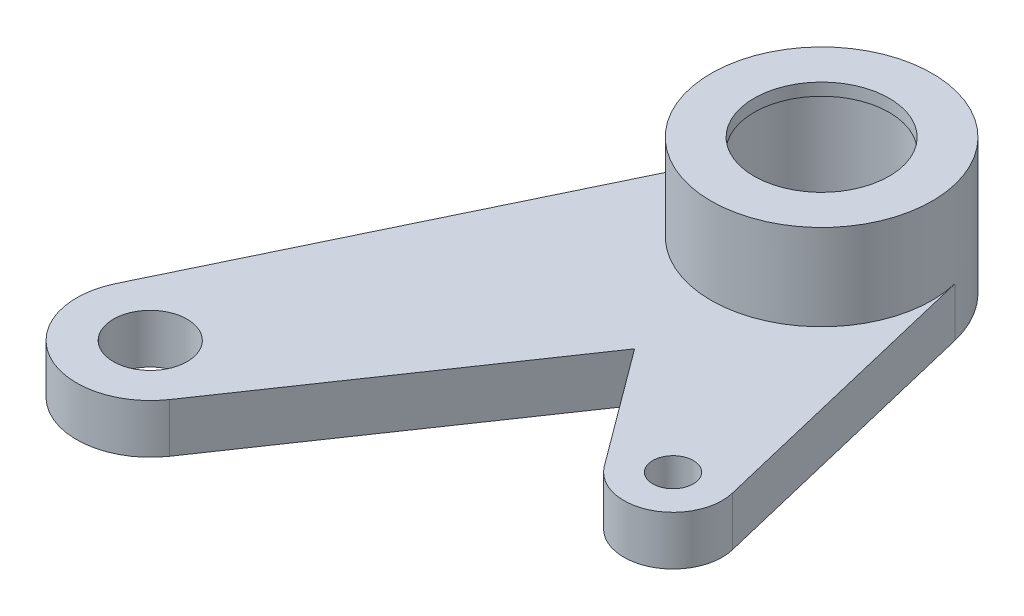
ISO-10303-21;
HEADER;
FILE_DESCRIPTION(('STEP AP214'),'2;1');
FILE_NAME('part.step','',(''),(''),'','','');
FILE_SCHEMA(('AUTOMOTIVE_DESIGN { 1 0 10303 214 1 1 1 1 }'));
ENDSEC;
DATA;
#1=APPLICATION_CONTEXT('core data for automotive mechanical design processes');
#2=APPLICATION_PROTOCOL_DEFINITION('international standard','automotive_design',2000,#1);
#3=PRODUCT_CONTEXT('',#1,'mechanical');
#4=PRODUCT('Part','Part','',(#3));
#5=PRODUCT_RELATED_PRODUCT_CATEGORY('part','',(#4));
#6=PRODUCT_DEFINITION_FORMATION('','',#4);
#7=PRODUCT_DEFINITION_CONTEXT('part definition',#1,'design');
#8=PRODUCT_DEFINITION('design','',#6,#7);
#9=PRODUCT_DEFINITION_SHAPE('','',#8);
#10=(LENGTH_UNIT() NAMED_UNIT(*) SI_UNIT(.MILLI.,.METRE.));
#11=(NAMED_UNIT(*) PLANE_ANGLE_UNIT() SI_UNIT($,.RADIAN.));
#12=(NAMED_UNIT(*) SI_UNIT($,.STERADIAN.) SOLID_ANGLE_UNIT());
#13=UNCERTAINTY_MEASURE_WITH_UNIT(LENGTH_MEASURE(1.E-05),#10,'distance_accuracy_value','');
#14=(GEOMETRIC_REPRESENTATION_CONTEXT(3) GLOBAL_UNCERTAINTY_ASSIGNED_CONTEXT((#13)) GLOBAL_UNIT_ASSIGNED_CONTEXT((#10,
#11,#12)) REPRESENTATION_CONTEXT('',''));
#15=CARTESIAN_POINT('',(0.,0.,0.));
#16=DIRECTION('',(0.,0.,1.));
#17=DIRECTION('',(1.,0.,0.));
#18=AXIS2_PLACEMENT_3D('',#15,#16,#17);
#19=CARTESIAN_POINT('',(4.16810157618354,4.70472468208189,-12.2850422261165));
#20=DIRECTION('',(0.,-1.,0.));
#21=DIRECTION('',(0.,0.,-1.));
#22=AXIS2_PLACEMENT_3D('',#19,#20,#21);
#23=CYLINDRICAL_SURFACE('',#22,18.);
#24=CARTESIAN_POINT('',(4.16810157618354,-3.29527531791811,-12.2850422261165));
#25=DIRECTION('',(0.,1.,0.));
#26=DIRECTION('',(0.,0.,1.));
#27=AXIS2_PLACEMENT_3D('',#24,#25,#26);
#28=CIRCLE('',#27,18.);
#29=CARTESIAN_POINT('',(21.6734670411358,-3.29527531791811,-16.4757676929608));
#30=VERTEX_POINT('',#29);
#31=CARTESIAN_POINT('',(-12.0514513282907,-3.29527531791811,-20.0905597348381));
#32=VERTEX_POINT('',#31);
#33=EDGE_CURVE('E130',#30,#32,#28,.T.);
#34=ORIENTED_EDGE('',*,*,#33,.T.);
#35=DIRECTION('',(0.,-1.,0.));
#36=VECTOR('',#35,1.);
#37=CARTESIAN_POINT('',(-12.0514513282907,4.70472468208189,-20.0905597348381));
#38=LINE('',#37,#36);
#39=CARTESIAN_POINT('',(-12.0514513282907,4.70472468208189,-20.0905597348381));
#40=VERTEX_POINT('',#39);
#41=EDGE_CURVE('E46',#40,#32,#38,.T.);
#42=ORIENTED_EDGE('',*,*,#41,.F.);
#43=CARTESIAN_POINT('',(4.16810157618354,4.70472468208189,-12.2850422261165));
#44=DIRECTION('',(0.,1.,0.));
#45=DIRECTION('',(0.,0.,1.));
#46=AXIS2_PLACEMENT_3D('',#43,#44,#45);
#47=CIRCLE('',#46,18.);
#48=CARTESIAN_POINT('',(21.6734670411358,4.70472468208189,-16.4757676929608));
#49=VERTEX_POINT('',#48);
#50=EDGE_CURVE('E11',#40,#49,#47,.T.);
#51=ORIENTED_EDGE('',*,*,#50,.T.);
#52=DIRECTION('',(0.,-1.,0.));
#53=VECTOR('',#52,1.);
#54=CARTESIAN_POINT('',(21.6734670411358,4.70472468208189,-16.4757676929608));
#55=LINE('',#54,#53);
#56=EDGE_CURVE('E146',#49,#30,#55,.T.);
#57=ORIENTED_EDGE('',*,*,#56,.T.);
#58=EDGE_LOOP('',(#34,#42,#51,#57));
#59=FACE_BOUND('',#58,.T.);
#60=CARTESIAN_POINT('',(4.16810157618354,18.7047246820819,-12.2850422261165));
#61=DIRECTION('',(0.,1.,0.));
#62=DIRECTION('',(0.,0.,1.));
#63=AXIS2_PLACEMENT_3D('',#60,#61,#62);
#64=CIRCLE('',#63,18.);
#65=CARTESIAN_POINT('',(4.16810157618354,18.7047246820819,5.71495777388353));
#66=VERTEX_POINT('',#65);
#67=EDGE_CURVE('E134',#66,#66,#64,.T.);
#68=ORIENTED_EDGE('',*,*,#67,.F.);
#69=EDGE_LOOP('',(#68));
#70=FACE_BOUND('',#69,.T.);
#71=ADVANCED_FACE('F37',(#59,#70),#23,.T.);
#72=CARTESIAN_POINT('',(-12.0514513282907,4.70472468208189,-20.0905597348381));
#73=DIRECTION('',(0.901086272470793,0.,0.433639861595646));
#74=DIRECTION('',(0.433639861595646,0.,-0.901086272470793));
#75=AXIS2_PLACEMENT_3D('',#72,#73,#74);
#76=PLANE('',#75);
#77=DIRECTION('',(-0.433639861595646,0.,0.901086272470793));
#78=VECTOR('',#77,1.);
#79=CARTESIAN_POINT('',(-12.0514513282907,-3.29527531791811,-20.0905597348381));
#80=LINE('',#79,#78);
#81=CARTESIAN_POINT('',(-46.6449336934661,-3.29527531791811,51.7933117374908));
#82=VERTEX_POINT('',#81);
#83=EDGE_CURVE('E133',#32,#82,#80,.T.);
#84=ORIENTED_EDGE('',*,*,#83,.T.);
#85=DIRECTION('',(0.,-1.,0.));
#86=VECTOR('',#85,1.);
#87=CARTESIAN_POINT('',(-46.6449336934661,4.70472468208189,51.7933117374908));
#88=LINE('',#87,#86);
#89=CARTESIAN_POINT('',(-46.6449336934661,4.70472468208189,51.7933117374908));
#90=VERTEX_POINT('',#89);
#91=EDGE_CURVE('E149',#90,#82,#88,.T.);
#92=ORIENTED_EDGE('',*,*,#91,.F.);
#93=DIRECTION('',(-0.433639861595646,0.,0.901086272470793));
#94=VECTOR('',#93,1.);
#95=CARTESIAN_POINT('',(-12.0514513282907,4.70472468208189,-20.0905597348381));
#96=LINE('',#95,#94);
#97=EDGE_CURVE('E143',#40,#90,#96,.T.);
#98=ORIENTED_EDGE('',*,*,#97,.F.);
#99=ORIENTED_EDGE('',*,*,#41,.T.);
#100=EDGE_LOOP('',(#84,#92,#98,#99));
#101=FACE_BOUND('',#100,.T.);
#102=ADVANCED_FACE('F196',(#101),#76,.F.);
#103=CARTESIAN_POINT('',(-35.8318984238165,4.70472468208189,56.9969900766386));
#104=DIRECTION('',(0.,-1.,0.));
#105=DIRECTION('',(0.,0.,-1.));
#106=AXIS2_PLACEMENT_3D('',#103,#104,#105);
#107=CYLINDRICAL_SURFACE('',#106,12.);
#108=CARTESIAN_POINT('',(-35.8318984238165,-3.29527531791811,56.9969900766386));
#109=DIRECTION('',(0.,1.,0.));
#110=DIRECTION('',(0.,0.,1.));
#111=AXIS2_PLACEMENT_3D('',#108,#109,#110);
#112=CIRCLE('',#111,12.);
#113=CARTESIAN_POINT('',(-25.918863154167,-3.29527531791811,63.7595141425983));
#114=VERTEX_POINT('',#113);
#115=EDGE_CURVE('E136',#82,#114,#112,.T.);
#116=ORIENTED_EDGE('',*,*,#115,.T.);
#117=DIRECTION('',(0.,-1.,0.));
#118=VECTOR('',#117,1.);
#119=CARTESIAN_POINT('',(-25.918863154167,4.70472468208189,63.7595141425983));
#120=LINE('',#119,#118);
#121=CARTESIAN_POINT('',(-25.918863154167,4.70472468208189,63.7595141425983));
#122=VERTEX_POINT('',#121);
#123=EDGE_CURVE('E121',#122,#114,#120,.T.);
#124=ORIENTED_EDGE('',*,*,#123,.F.);
#125=CARTESIAN_POINT('',(-35.8318984238165,4.70472468208189,56.9969900766386));
#126=DIRECTION('',(0.,1.,0.));
#127=DIRECTION('',(0.,0.,1.));
#128=AXIS2_PLACEMENT_3D('',#125,#126,#127);
#129=CIRCLE('',#128,12.);
#130=EDGE_CURVE('E109',#90,#122,#129,.T.);
#131=ORIENTED_EDGE('',*,*,#130,.F.);
#132=ORIENTED_EDGE('',*,*,#91,.T.);
#133=EDGE_LOOP('',(#116,#124,#131,#132));
#134=FACE_BOUND('',#133,.T.);
#135=ADVANCED_FACE('F201',(#134),#107,.T.);
#136=CARTESIAN_POINT('',(4.77402818421152,4.70472468208189,18.7674798966269));
#137=DIRECTION('',(-0.826086272470793,0.,-0.563543672163312));
#138=DIRECTION('',(-0.563543672163312,0.,0.826086272470793));
#139=AXIS2_PLACEMENT_3D('',#136,#137,#138);
#140=PLANE('',#139);
#141=DIRECTION('',(0.563543672163312,0.,-0.826086272470793));
#142=VECTOR('',#141,1.);
#143=CARTESIAN_POINT('',(4.77402818421152,-3.29527531791811,18.7674798966269));
#144=LINE('',#143,#142);
#145=CARTESIAN_POINT('',(4.77402818421152,-3.29527531791811,18.7674798966269));
#146=VERTEX_POINT('',#145);
#147=EDGE_CURVE('E118',#114,#146,#144,.T.);
#148=ORIENTED_EDGE('',*,*,#147,.T.);
#149=DIRECTION('',(0.,-1.,0.));
#150=VECTOR('',#149,1.);
#151=CARTESIAN_POINT('',(4.77402818421152,4.70472468208189,18.7674798966269));
#152=LINE('',#151,#150);
#153=CARTESIAN_POINT('',(4.77402818421152,4.70472468208189,18.7674798966269));
#154=VERTEX_POINT('',#153);
#155=EDGE_CURVE('E115',#154,#146,#152,.T.);
#156=ORIENTED_EDGE('',*,*,#155,.F.);
#157=DIRECTION('',(0.563543672163312,0.,-0.826086272470793));
#158=VECTOR('',#157,1.);
#159=CARTESIAN_POINT('',(4.77402818421152,4.70472468208189,18.7674798966269));
#160=LINE('',#159,#158);
#161=EDGE_CURVE('E102',#122,#154,#160,.T.);
#162=ORIENTED_EDGE('',*,*,#161,.F.);
#163=ORIENTED_EDGE('',*,*,#123,.T.);
#164=EDGE_LOOP('',(#148,#156,#162,#163));
#165=FACE_BOUND('',#164,.T.);
#166=ADVANCED_FACE('F116',(#165),#140,.F.);
#167=CARTESIAN_POINT('',(18.8712306719212,4.70472468208189,37.7930766961641));
#168=DIRECTION('',(0.803472998912177,0.,-0.595341196306011));
#169=DIRECTION('',(-0.595341196306011,0.,-0.803472998912177));
#170=AXIS2_PLACEMENT_3D('',#167,#168,#169);
#171=PLANE('',#170);
#172=DIRECTION('',(0.595341196306011,0.,0.803472998912177));
#173=VECTOR('',#172,1.);
#174=CARTESIAN_POINT('',(18.8712306719212,-3.29527531791811,37.7930766961641));
#175=LINE('',#174,#173);
#176=CARTESIAN_POINT('',(18.8712306719212,-3.29527531791811,37.7930766961641));
#177=VERTEX_POINT('',#176);
#178=EDGE_CURVE('E139',#146,#177,#175,.T.);
#179=ORIENTED_EDGE('',*,*,#178,.T.);
#180=DIRECTION('',(0.,-1.,0.));
#181=VECTOR('',#180,1.);
#182=CARTESIAN_POINT('',(18.8712306719212,4.70472468208189,37.7930766961641));
#183=LINE('',#182,#181);
#184=CARTESIAN_POINT('',(18.8712306719212,4.70472468208189,37.7930766961641));
#185=VERTEX_POINT('',#184);
#186=EDGE_CURVE('E122',#185,#177,#183,.T.);
#187=ORIENTED_EDGE('',*,*,#186,.F.);
#188=DIRECTION('',(0.595341196306011,0.,0.803472998912177));
#189=VECTOR('',#188,1.);
#190=CARTESIAN_POINT('',(18.8712306719212,4.70472468208189,37.7930766961641));
#191=LINE('',#190,#189);
#192=EDGE_CURVE('E106',#154,#185,#191,.T.);
#193=ORIENTED_EDGE('',*,*,#192,.F.);
#194=ORIENTED_EDGE('',*,*,#155,.T.);
#195=EDGE_LOOP('',(#179,#187,#193,#194));
#196=FACE_BOUND('',#195,.T.);
#197=ADVANCED_FACE('F124',(#196),#171,.F.);
#198=CARTESIAN_POINT('',(25.2990146632186,4.70472468208189,33.030347125716));
#199=DIRECTION('',(0.,-1.,0.));
#200=DIRECTION('',(0.,0.,-1.));
#201=AXIS2_PLACEMENT_3D('',#198,#199,#200);
#202=CYLINDRICAL_SURFACE('',#201,8.);
#203=CARTESIAN_POINT('',(25.2990146632186,-3.29527531791811,33.030347125716));
#204=DIRECTION('',(0.,1.,0.));
#205=DIRECTION('',(0.,0.,1.));
#206=AXIS2_PLACEMENT_3D('',#203,#204,#205);
#207=CIRCLE('',#206,8.);
#208=CARTESIAN_POINT('',(33.0791770920862,-3.29527531791811,31.1678024737852));
#209=VERTEX_POINT('',#208);
#210=EDGE_CURVE('E81',#177,#209,#207,.T.);
#211=ORIENTED_EDGE('',*,*,#210,.T.);
#212=DIRECTION('',(0.,-1.,0.));
#213=VECTOR('',#212,1.);
#214=CARTESIAN_POINT('',(33.0791770920862,4.70472468208189,31.1678024737852));
#215=LINE('',#214,#213);
#216=CARTESIAN_POINT('',(33.0791770920862,4.70472468208189,31.1678024737852));
#217=VERTEX_POINT('',#216);
#218=EDGE_CURVE('E144',#217,#209,#215,.T.);
#219=ORIENTED_EDGE('',*,*,#218,.F.);
#220=CARTESIAN_POINT('',(25.2990146632186,4.70472468208189,33.030347125716));
#221=DIRECTION('',(0.,1.,0.));
#222=DIRECTION('',(0.,0.,1.));
#223=AXIS2_PLACEMENT_3D('',#220,#221,#222);
#224=CIRCLE('',#223,8.);
#225=EDGE_CURVE('E55',#185,#217,#224,.T.);
#226=ORIENTED_EDGE('',*,*,#225,.F.);
#227=ORIENTED_EDGE('',*,*,#186,.T.);
#228=EDGE_LOOP('',(#211,#219,#226,#227));
#229=FACE_BOUND('',#228,.T.);
#230=ADVANCED_FACE('F210',(#229),#202,.T.);
#231=CARTESIAN_POINT('',(21.6734670411358,4.70472468208189,-16.4757676929608));
#232=DIRECTION('',(-0.972520303608458,0.,0.232818081491352));
#233=DIRECTION('',(0.232818081491352,0.,0.972520303608458));
#234=AXIS2_PLACEMENT_3D('',#231,#232,#233);
#235=PLANE('',#234);
#236=DIRECTION('',(-0.232818081491352,0.,-0.972520303608458));
#237=VECTOR('',#236,1.);
#238=CARTESIAN_POINT('',(21.6734670411358,-3.29527531791811,-16.4757676929608));
#239=LINE('',#238,#237);
#240=EDGE_CURVE('E88',#209,#30,#239,.T.);
#241=ORIENTED_EDGE('',*,*,#240,.T.);
#242=ORIENTED_EDGE('',*,*,#56,.F.);
#243=DIRECTION('',(-0.232818081491352,0.,-0.972520303608458));
#244=VECTOR('',#243,1.);
#245=CARTESIAN_POINT('',(21.6734670411358,4.70472468208189,-16.4757676929608));
#246=LINE('',#245,#244);
#247=EDGE_CURVE('E126',#217,#49,#246,.T.);
#248=ORIENTED_EDGE('',*,*,#247,.F.);
#249=ORIENTED_EDGE('',*,*,#218,.T.);
#250=EDGE_LOOP('',(#241,#242,#248,#249));
#251=FACE_BOUND('',#250,.T.);
#252=ADVANCED_FACE('F212',(#251),#235,.F.);
#253=CARTESIAN_POINT('',(4.16810157618354,4.70472468208189,-12.2850422261165));
#254=DIRECTION('',(0.,1.,0.));
#255=DIRECTION('',(0.,0.,1.));
#256=AXIS2_PLACEMENT_3D('',#253,#254,#255);
#257=PLANE('',#256);
#258=CARTESIAN_POINT('',(25.2990146632186,4.70472468208189,33.030347125716));
#259=DIRECTION('',(0.,1.,0.));
#260=DIRECTION('',(0.,0.,1.));
#261=AXIS2_PLACEMENT_3D('',#258,#259,#260);
#262=CIRCLE('',#261,3.29999999999998);
#263=CARTESIAN_POINT('',(25.2990146632186,4.70472468208189,36.330347125716));
#264=VERTEX_POINT('',#263);
#265=EDGE_CURVE('E183',#264,#264,#262,.T.);
#266=ORIENTED_EDGE('',*,*,#265,.F.);
#267=EDGE_LOOP('',(#266));
#268=FACE_BOUND('',#267,.T.);
#269=CARTESIAN_POINT('',(-35.8318984238165,4.70472468208189,56.9969900766386));
#270=DIRECTION('',(0.,1.,0.));
#271=DIRECTION('',(0.,0.,1.));
#272=AXIS2_PLACEMENT_3D('',#269,#270,#271);
#273=CIRCLE('',#272,6.);
#274=CARTESIAN_POINT('',(-35.8318984238165,4.70472468208189,62.9969900766386));
#275=VERTEX_POINT('',#274);
#276=EDGE_CURVE('E168',#275,#275,#273,.T.);
#277=ORIENTED_EDGE('',*,*,#276,.F.);
#278=EDGE_LOOP('',(#277));
#279=FACE_BOUND('',#278,.T.);
#280=ORIENTED_EDGE('',*,*,#50,.F.);
#281=ORIENTED_EDGE('',*,*,#97,.T.);
#282=ORIENTED_EDGE('',*,*,#130,.T.);
#283=ORIENTED_EDGE('',*,*,#161,.T.);
#284=ORIENTED_EDGE('',*,*,#192,.T.);
#285=ORIENTED_EDGE('',*,*,#225,.T.);
#286=ORIENTED_EDGE('',*,*,#247,.T.);
#287=EDGE_LOOP('',(#280,#281,#282,#283,#284,#285,#286));
#288=FACE_BOUND('',#287,.T.);
#289=ADVANCED_FACE('F104',(#268,#279,#288),#257,.T.);
#290=CARTESIAN_POINT('',(4.16810157618354,-3.29527531791811,-12.2850422261165));
#291=DIRECTION('',(0.,1.,0.));
#292=DIRECTION('',(0.,0.,1.));
#293=AXIS2_PLACEMENT_3D('',#290,#291,#292);
#294=PLANE('',#293);
#295=CARTESIAN_POINT('',(25.2990146632186,-3.29527531791811,33.030347125716));
#296=DIRECTION('',(0.,1.,0.));
#297=DIRECTION('',(0.,0.,1.));
#298=AXIS2_PLACEMENT_3D('',#295,#296,#297);
#299=CIRCLE('',#298,3.29999999999999);
#300=CARTESIAN_POINT('',(25.2990146632186,-3.29527531791811,36.330347125716));
#301=VERTEX_POINT('',#300);
#302=EDGE_CURVE('E40',#301,#301,#299,.T.);
#303=ORIENTED_EDGE('',*,*,#302,.T.);
#304=EDGE_LOOP('',(#303));
#305=FACE_BOUND('',#304,.T.);
#306=CARTESIAN_POINT('',(4.16810157618354,-3.29527531791811,-12.2850422261165));
#307=DIRECTION('',(0.,-1.,0.));
#308=DIRECTION('',(0.,0.,-1.));
#309=AXIS2_PLACEMENT_3D('',#306,#307,#308);
#310=CIRCLE('',#309,12.);
#311=CARTESIAN_POINT('',(4.16810157618354,-3.29527531791811,-24.2850422261165));
#312=VERTEX_POINT('',#311);
#313=EDGE_CURVE('E171',#312,#312,#310,.T.);
#314=ORIENTED_EDGE('',*,*,#313,.F.);
#315=EDGE_LOOP('',(#314));
#316=FACE_BOUND('',#315,.T.);
#317=CARTESIAN_POINT('',(-35.8318984238165,-3.29527531791811,56.9969900766386));
#318=DIRECTION('',(0.,1.,0.));
#319=DIRECTION('',(0.,0.,1.));
#320=AXIS2_PLACEMENT_3D('',#317,#318,#319);
#321=CIRCLE('',#320,6.);
#322=CARTESIAN_POINT('',(-35.8318984238165,-3.29527531791811,62.9969900766386));
#323=VERTEX_POINT('',#322);
#324=EDGE_CURVE('E166',#323,#323,#321,.T.);
#325=ORIENTED_EDGE('',*,*,#324,.T.);
#326=EDGE_LOOP('',(#325));
#327=FACE_BOUND('',#326,.T.);
#328=ORIENTED_EDGE('',*,*,#33,.F.);
#329=ORIENTED_EDGE('',*,*,#240,.F.);
#330=ORIENTED_EDGE('',*,*,#210,.F.);
#331=ORIENTED_EDGE('',*,*,#178,.F.);
#332=ORIENTED_EDGE('',*,*,#147,.F.);
#333=ORIENTED_EDGE('',*,*,#115,.F.);
#334=ORIENTED_EDGE('',*,*,#83,.F.);
#335=EDGE_LOOP('',(#328,#329,#330,#331,#332,#333,#334));
#336=FACE_BOUND('',#335,.T.);
#337=ADVANCED_FACE('F206',(#305,#316,#327,#336),#294,.F.);
#338=CARTESIAN_POINT('',(4.16810157618354,18.7047246820819,-12.2850422261165));
#339=DIRECTION('',(0.,1.,0.));
#340=DIRECTION('',(0.,0.,1.));
#341=AXIS2_PLACEMENT_3D('',#338,#339,#340);
#342=PLANE('',#341);
#343=CARTESIAN_POINT('',(4.16810157618354,18.7047246820819,-12.2850422261165));
#344=DIRECTION('',(0.,1.,0.));
#345=DIRECTION('',(0.,0.,1.));
#346=AXIS2_PLACEMENT_3D('',#343,#344,#345);
#347=CIRCLE('',#346,11.);
#348=CARTESIAN_POINT('',(4.16810157618354,18.7047246820819,-1.28504222611647));
#349=VERTEX_POINT('',#348);
#350=EDGE_CURVE('E172',#349,#349,#347,.T.);
#351=ORIENTED_EDGE('',*,*,#350,.F.);
#352=EDGE_LOOP('',(#351));
#353=FACE_BOUND('',#352,.T.);
#354=ORIENTED_EDGE('',*,*,#67,.T.);
#355=EDGE_LOOP('',(#354));
#356=FACE_BOUND('',#355,.T.);
#357=ADVANCED_FACE('F193',(#353,#356),#342,.T.);
#358=CARTESIAN_POINT('',(-35.8318984238165,-3.29532531791811,56.9969900766386));
#359=DIRECTION('',(0.,1.,0.));
#360=DIRECTION('',(0.,0.,1.));
#361=AXIS2_PLACEMENT_3D('',#358,#359,#360);
#362=CYLINDRICAL_SURFACE('',#361,6.);
#363=ORIENTED_EDGE('',*,*,#276,.T.);
#364=EDGE_LOOP('',(#363));
#365=FACE_BOUND('',#364,.T.);
#366=ORIENTED_EDGE('',*,*,#324,.F.);
#367=EDGE_LOOP('',(#366));
#368=FACE_BOUND('',#367,.T.);
#369=ADVANCED_FACE('F274',(#365,#368),#362,.F.);
#370=CARTESIAN_POINT('',(4.16810157618354,16.7047246820819,-12.2850422261165));
#371=DIRECTION('',(0.,-1.,0.));
#372=DIRECTION('',(0.,0.,-1.));
#373=AXIS2_PLACEMENT_3D('',#370,#371,#372);
#374=CYLINDRICAL_SURFACE('',#373,12.);
#375=CARTESIAN_POINT('',(4.16810157618354,16.7047246820819,-12.2850422261165));
#376=DIRECTION('',(0.,-1.,0.));
#377=DIRECTION('',(0.,0.,-1.));
#378=AXIS2_PLACEMENT_3D('',#375,#376,#377);
#379=CIRCLE('',#378,12.);
#380=CARTESIAN_POINT('',(4.16810157618354,16.7047246820819,-24.2850422261165));
#381=VERTEX_POINT('',#380);
#382=EDGE_CURVE('E176',#381,#381,#379,.T.);
#383=ORIENTED_EDGE('',*,*,#382,.F.);
#384=EDGE_LOOP('',(#383));
#385=FACE_BOUND('',#384,.T.);
#386=ORIENTED_EDGE('',*,*,#313,.T.);
#387=EDGE_LOOP('',(#386));
#388=FACE_BOUND('',#387,.T.);
#389=ADVANCED_FACE('F284',(#385,#388),#374,.F.);
#390=CARTESIAN_POINT('',(4.16810157618354,16.7047246820819,-12.2850422261165));
#391=DIRECTION('',(0.,-1.,0.));
#392=DIRECTION('',(0.,0.,-1.));
#393=AXIS2_PLACEMENT_3D('',#390,#391,#392);
#394=PLANE('',#393);
#395=CARTESIAN_POINT('',(4.16810157618354,16.7047246820819,-12.2850422261165));
#396=DIRECTION('',(0.,-1.,0.));
#397=DIRECTION('',(0.,0.,-1.));
#398=AXIS2_PLACEMENT_3D('',#395,#396,#397);
#399=CIRCLE('',#398,11.);
#400=CARTESIAN_POINT('',(4.16810157618354,16.7047246820819,-23.2850422261165));
#401=VERTEX_POINT('',#400);
#402=EDGE_CURVE('E169',#401,#401,#399,.T.);
#403=ORIENTED_EDGE('',*,*,#402,.F.);
#404=EDGE_LOOP('',(#403));
#405=FACE_BOUND('',#404,.T.);
#406=ORIENTED_EDGE('',*,*,#382,.T.);
#407=EDGE_LOOP('',(#406));
#408=FACE_BOUND('',#407,.T.);
#409=ADVANCED_FACE('F294',(#405,#408),#394,.T.);
#410=CARTESIAN_POINT('',(4.16810157618354,-3.29532531791812,-12.2850422261165));
#411=DIRECTION('',(0.,1.,0.));
#412=DIRECTION('',(0.,0.,1.));
#413=AXIS2_PLACEMENT_3D('',#410,#411,#412);
#414=CYLINDRICAL_SURFACE('',#413,11.);
#415=ORIENTED_EDGE('',*,*,#402,.T.);
#416=EDGE_LOOP('',(#415));
#417=FACE_BOUND('',#416,.T.);
#418=ORIENTED_EDGE('',*,*,#350,.T.);
#419=EDGE_LOOP('',(#418));
#420=FACE_BOUND('',#419,.T.);
#421=ADVANCED_FACE('F304',(#417,#420),#414,.F.);
#422=CARTESIAN_POINT('',(25.2990146632186,4.70472468208189,33.030347125716));
#423=DIRECTION('',(0.,1.,0.));
#424=DIRECTION('',(0.,0.,1.));
#425=AXIS2_PLACEMENT_3D('',#422,#423,#424);
#426=CYLINDRICAL_SURFACE('',#425,3.29999999999999);
#427=ORIENTED_EDGE('',*,*,#265,.T.);
#428=EDGE_LOOP('',(#427));
#429=FACE_BOUND('',#428,.T.);
#430=ORIENTED_EDGE('',*,*,#302,.F.);
#431=EDGE_LOOP('',(#430));
#432=FACE_BOUND('',#431,.T.);
#433=ADVANCED_FACE('F314',(#429,#432),#426,.F.);
#434=CLOSED_SHELL('',(#71,#102,#135,#166,#197,#230,#252,#289,#337,#357,#369,#389,#409,#421,#433));
#435=MANIFOLD_SOLID_BREP('B2',#434);
#436=ADVANCED_BREP_SHAPE_REPRESENTATION('',(#18,#435),#14);
#437=SHAPE_DEFINITION_REPRESENTATION(#9,#436);
ENDSEC;
END-ISO-10303-21;
